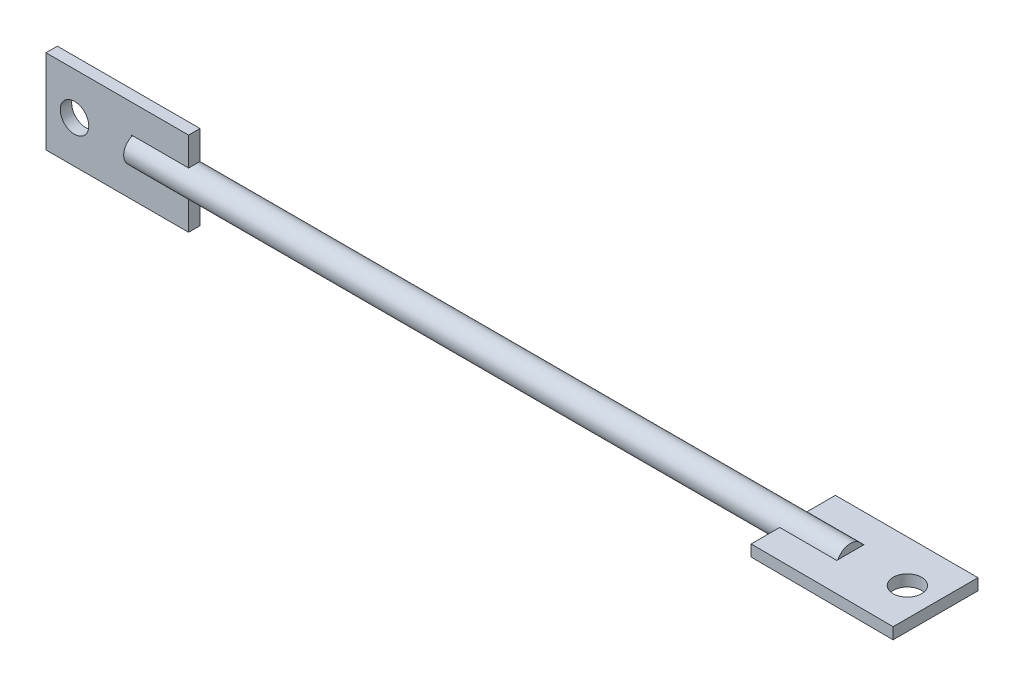
ISO-10303-21;
HEADER;
FILE_DESCRIPTION(('STEP AP214'),'2;1');
FILE_NAME('part.step','',(''),(''),'','','');
FILE_SCHEMA(('AUTOMOTIVE_DESIGN { 1 0 10303 214 1 1 1 1 }'));
ENDSEC;
DATA;
#1=APPLICATION_CONTEXT('core data for automotive mechanical design processes');
#2=APPLICATION_PROTOCOL_DEFINITION('international standard','automotive_design',2000,#1);
#3=PRODUCT_CONTEXT('',#1,'mechanical');
#4=PRODUCT('Part','Part','',(#3));
#5=PRODUCT_RELATED_PRODUCT_CATEGORY('part','',(#4));
#6=PRODUCT_DEFINITION_FORMATION('','',#4);
#7=PRODUCT_DEFINITION_CONTEXT('part definition',#1,'design');
#8=PRODUCT_DEFINITION('design','',#6,#7);
#9=PRODUCT_DEFINITION_SHAPE('','',#8);
#10=(LENGTH_UNIT() NAMED_UNIT(*) SI_UNIT(.MILLI.,.METRE.));
#11=(NAMED_UNIT(*) PLANE_ANGLE_UNIT() SI_UNIT($,.RADIAN.));
#12=(NAMED_UNIT(*) SI_UNIT($,.STERADIAN.) SOLID_ANGLE_UNIT());
#13=UNCERTAINTY_MEASURE_WITH_UNIT(LENGTH_MEASURE(1.E-05),#10,'distance_accuracy_value','');
#14=(GEOMETRIC_REPRESENTATION_CONTEXT(3) GLOBAL_UNCERTAINTY_ASSIGNED_CONTEXT((#13)) GLOBAL_UNIT_ASSIGNED_CONTEXT((#10,
#11,#12)) REPRESENTATION_CONTEXT('',''));
#15=CARTESIAN_POINT('',(0.,0.,0.));
#16=DIRECTION('',(0.,0.,1.));
#17=DIRECTION('',(1.,0.,0.));
#18=AXIS2_PLACEMENT_3D('',#15,#16,#17);
#19=CARTESIAN_POINT('',(0.,2.,-14.7625));
#20=DIRECTION('',(0.,0.,1.));
#21=DIRECTION('',(1.,0.,0.));
#22=AXIS2_PLACEMENT_3D('',#19,#20,#21);
#23=PLANE('',#22);
#24=DIRECTION('',(-1.,0.,0.));
#25=VECTOR('',#24,1.);
#26=CARTESIAN_POINT('',(0.,-2.,-14.7625));
#27=LINE('',#26,#25);
#28=CARTESIAN_POINT('',(155.,-2.,-14.7625000000001));
#29=VERTEX_POINT('',#28);
#30=CARTESIAN_POINT('',(105.,-2.,-14.7625));
#31=VERTEX_POINT('',#30);
#32=EDGE_CURVE('E151',#29,#31,#27,.T.);
#33=ORIENTED_EDGE('',*,*,#32,.T.);
#34=DIRECTION('',(0.,-1.,0.));
#35=VECTOR('',#34,1.);
#36=CARTESIAN_POINT('',(105.,2.,-14.7625));
#37=LINE('',#36,#35);
#38=CARTESIAN_POINT('',(105.,2.,-14.7625));
#39=VERTEX_POINT('',#38);
#40=EDGE_CURVE('E13',#39,#31,#37,.T.);
#41=ORIENTED_EDGE('',*,*,#40,.F.);
#42=DIRECTION('',(-1.,0.,0.));
#43=VECTOR('',#42,1.);
#44=CARTESIAN_POINT('',(0.,2.,-14.7625));
#45=LINE('',#44,#43);
#46=CARTESIAN_POINT('',(155.,2.,-14.7625000000001));
#47=VERTEX_POINT('',#46);
#48=EDGE_CURVE('E196',#47,#39,#45,.T.);
#49=ORIENTED_EDGE('',*,*,#48,.F.);
#50=DIRECTION('',(0.,-1.,0.));
#51=VECTOR('',#50,1.);
#52=CARTESIAN_POINT('',(155.,2.,-14.7625000000001));
#53=LINE('',#52,#51);
#54=EDGE_CURVE('E144',#47,#29,#53,.T.);
#55=ORIENTED_EDGE('',*,*,#54,.T.);
#56=EDGE_LOOP('',(#33,#41,#49,#55));
#57=FACE_BOUND('',#56,.T.);
#58=ADVANCED_FACE('F52',(#57),#23,.F.);
#59=CARTESIAN_POINT('',(105.,2.,-2.91433543964104E-13));
#60=DIRECTION('',(1.,0.,0.));
#61=DIRECTION('',(0.,0.,-1.));
#62=AXIS2_PLACEMENT_3D('',#59,#60,#61);
#63=PLANE('',#62);
#64=DIRECTION('',(0.,0.,1.));
#65=VECTOR('',#64,1.);
#66=CARTESIAN_POINT('',(105.,-2.,-2.91433543964104E-13));
#67=LINE('',#66,#65);
#68=CARTESIAN_POINT('',(105.,-2.,-4.76250000000004));
#69=VERTEX_POINT('',#68);
#70=EDGE_CURVE('E154',#31,#69,#67,.T.);
#71=ORIENTED_EDGE('',*,*,#70,.T.);
#72=DIRECTION('',(0.,-1.,0.));
#73=VECTOR('',#72,1.);
#74=CARTESIAN_POINT('',(105.,2.,-4.76250000000004));
#75=LINE('',#74,#73);
#76=CARTESIAN_POINT('',(105.,2.,-4.76250000000004));
#77=VERTEX_POINT('',#76);
#78=EDGE_CURVE('E61',#77,#69,#75,.T.);
#79=ORIENTED_EDGE('',*,*,#78,.F.);
#80=DIRECTION('',(0.,0.,1.));
#81=VECTOR('',#80,1.);
#82=CARTESIAN_POINT('',(105.,2.,-2.91433543964104E-13));
#83=LINE('',#82,#81);
#84=EDGE_CURVE('E112',#39,#77,#83,.T.);
#85=ORIENTED_EDGE('',*,*,#84,.F.);
#86=ORIENTED_EDGE('',*,*,#40,.T.);
#87=EDGE_LOOP('',(#71,#79,#85,#86));
#88=FACE_BOUND('',#87,.T.);
#89=ADVANCED_FACE('F182',(#88),#63,.F.);
#90=CARTESIAN_POINT('',(0.,2.,-4.76250000000002));
#91=DIRECTION('',(0.,0.,1.));
#92=DIRECTION('',(1.,0.,0.));
#93=AXIS2_PLACEMENT_3D('',#90,#91,#92);
#94=PLANE('',#93);
#95=DIRECTION('',(-1.,0.,0.));
#96=VECTOR('',#95,1.);
#97=CARTESIAN_POINT('',(0.,-2.,-4.76250000000002));
#98=LINE('',#97,#96);
#99=CARTESIAN_POINT('',(125.,-2.,-4.76250000000004));
#100=VERTEX_POINT('',#99);
#101=EDGE_CURVE('E157',#100,#69,#98,.T.);
#102=ORIENTED_EDGE('',*,*,#101,.F.);
#103=DIRECTION('',(0.,-1.,0.));
#104=VECTOR('',#103,1.);
#105=CARTESIAN_POINT('',(125.,2.,-4.76250000000004));
#106=LINE('',#105,#104);
#107=CARTESIAN_POINT('',(125.,2.,-4.76250000000004));
#108=VERTEX_POINT('',#107);
#109=EDGE_CURVE('E175',#108,#100,#106,.T.);
#110=ORIENTED_EDGE('',*,*,#109,.F.);
#111=DIRECTION('',(-1.,0.,0.));
#112=VECTOR('',#111,1.);
#113=CARTESIAN_POINT('',(0.,2.,-4.76250000000002));
#114=LINE('',#113,#112);
#115=EDGE_CURVE('E181',#108,#77,#114,.T.);
#116=ORIENTED_EDGE('',*,*,#115,.T.);
#117=ORIENTED_EDGE('',*,*,#78,.T.);
#118=EDGE_LOOP('',(#102,#110,#116,#117));
#119=FACE_BOUND('',#118,.T.);
#120=ADVANCED_FACE('F179',(#119),#94,.T.);
#121=CARTESIAN_POINT('',(125.,2.,0.));
#122=DIRECTION('',(1.,0.,0.));
#123=DIRECTION('',(0.,0.,-1.));
#124=AXIS2_PLACEMENT_3D('',#121,#122,#123);
#125=PLANE('',#124);
#126=DIRECTION('',(0.,0.,1.));
#127=VECTOR('',#126,1.);
#128=CARTESIAN_POINT('',(125.,-2.,0.));
#129=LINE('',#128,#127);
#130=CARTESIAN_POINT('',(125.,-2.,4.76249999999995));
#131=VERTEX_POINT('',#130);
#132=EDGE_CURVE('E160',#100,#131,#129,.T.);
#133=ORIENTED_EDGE('',*,*,#132,.T.);
#134=DIRECTION('',(0.,-1.,0.));
#135=VECTOR('',#134,1.);
#136=CARTESIAN_POINT('',(125.,2.,4.76249999999995));
#137=LINE('',#136,#135);
#138=CARTESIAN_POINT('',(125.,2.,4.76249999999995));
#139=VERTEX_POINT('',#138);
#140=EDGE_CURVE('E173',#139,#131,#137,.T.);
#141=ORIENTED_EDGE('',*,*,#140,.F.);
#142=DIRECTION('',(0.,0.,1.));
#143=VECTOR('',#142,1.);
#144=CARTESIAN_POINT('',(125.,2.,0.));
#145=LINE('',#144,#143);
#146=EDGE_CURVE('E193',#108,#139,#145,.T.);
#147=ORIENTED_EDGE('',*,*,#146,.F.);
#148=ORIENTED_EDGE('',*,*,#109,.T.);
#149=EDGE_LOOP('',(#133,#141,#147,#148));
#150=FACE_BOUND('',#149,.T.);
#151=ADVANCED_FACE('F191',(#150),#125,.F.);
#152=CARTESIAN_POINT('',(0.,2.,4.76249999999998));
#153=DIRECTION('',(0.,0.,-1.));
#154=DIRECTION('',(-1.,0.,0.));
#155=AXIS2_PLACEMENT_3D('',#152,#153,#154);
#156=PLANE('',#155);
#157=DIRECTION('',(1.,0.,0.));
#158=VECTOR('',#157,1.);
#159=CARTESIAN_POINT('',(0.,-2.,4.76249999999998));
#160=LINE('',#159,#158);
#161=CARTESIAN_POINT('',(105.,-2.,4.76249999999996));
#162=VERTEX_POINT('',#161);
#163=EDGE_CURVE('E163',#162,#131,#160,.T.);
#164=ORIENTED_EDGE('',*,*,#163,.F.);
#165=DIRECTION('',(0.,-1.,0.));
#166=VECTOR('',#165,1.);
#167=CARTESIAN_POINT('',(105.,2.,4.76249999999996));
#168=LINE('',#167,#166);
#169=CARTESIAN_POINT('',(105.,2.,4.76249999999996));
#170=VERTEX_POINT('',#169);
#171=EDGE_CURVE('E139',#170,#162,#168,.T.);
#172=ORIENTED_EDGE('',*,*,#171,.F.);
#173=DIRECTION('',(1.,0.,0.));
#174=VECTOR('',#173,1.);
#175=CARTESIAN_POINT('',(0.,2.,4.76249999999998));
#176=LINE('',#175,#174);
#177=EDGE_CURVE('E132',#170,#139,#176,.T.);
#178=ORIENTED_EDGE('',*,*,#177,.T.);
#179=ORIENTED_EDGE('',*,*,#140,.T.);
#180=EDGE_LOOP('',(#164,#172,#178,#179));
#181=FACE_BOUND('',#180,.T.);
#182=ADVANCED_FACE('F200',(#181),#156,.T.);
#183=CARTESIAN_POINT('',(105.,2.,0.));
#184=DIRECTION('',(1.,0.,0.));
#185=DIRECTION('',(0.,0.,-1.));
#186=AXIS2_PLACEMENT_3D('',#183,#184,#185);
#187=PLANE('',#186);
#188=DIRECTION('',(0.,0.,1.));
#189=VECTOR('',#188,1.);
#190=CARTESIAN_POINT('',(105.,-2.,0.));
#191=LINE('',#190,#189);
#192=CARTESIAN_POINT('',(105.,-2.,14.7625));
#193=VERTEX_POINT('',#192);
#194=EDGE_CURVE('E138',#162,#193,#191,.T.);
#195=ORIENTED_EDGE('',*,*,#194,.T.);
#196=DIRECTION('',(0.,-1.,0.));
#197=VECTOR('',#196,1.);
#198=CARTESIAN_POINT('',(105.,2.,14.7625));
#199=LINE('',#198,#197);
#200=CARTESIAN_POINT('',(105.,2.,14.7625));
#201=VERTEX_POINT('',#200);
#202=EDGE_CURVE('E135',#201,#193,#199,.T.);
#203=ORIENTED_EDGE('',*,*,#202,.F.);
#204=DIRECTION('',(0.,0.,1.));
#205=VECTOR('',#204,1.);
#206=CARTESIAN_POINT('',(105.,2.,0.));
#207=LINE('',#206,#205);
#208=EDGE_CURVE('E126',#170,#201,#207,.T.);
#209=ORIENTED_EDGE('',*,*,#208,.F.);
#210=ORIENTED_EDGE('',*,*,#171,.T.);
#211=EDGE_LOOP('',(#195,#203,#209,#210));
#212=FACE_BOUND('',#211,.T.);
#213=ADVANCED_FACE('F136',(#212),#187,.F.);
#214=CARTESIAN_POINT('',(-0.0674266261516821,2.,14.2659075417125));
#215=DIRECTION('',(0.00472636408478711,0.,-0.999988830678892));
#216=DIRECTION('',(-0.999988830678892,0.,-0.00472636408478711));
#217=AXIS2_PLACEMENT_3D('',#214,#215,#216);
#218=PLANE('',#217);
#219=DIRECTION('',(0.999988830678892,0.,0.00472636408478711));
#220=VECTOR('',#219,1.);
#221=CARTESIAN_POINT('',(-0.0674266261516821,-2.,14.2659075417125));
#222=LINE('',#221,#220);
#223=CARTESIAN_POINT('',(154.999441533945,-2.,14.9988182042393));
#224=VERTEX_POINT('',#223);
#225=EDGE_CURVE('E98',#193,#224,#222,.T.);
#226=ORIENTED_EDGE('',*,*,#225,.T.);
#227=DIRECTION('',(0.,-1.,0.));
#228=VECTOR('',#227,1.);
#229=CARTESIAN_POINT('',(154.999441533945,2.,14.9988182042393));
#230=LINE('',#229,#228);
#231=CARTESIAN_POINT('',(154.999441533945,2.,14.9988182042393));
#232=VERTEX_POINT('',#231);
#233=EDGE_CURVE('E140',#232,#224,#230,.T.);
#234=ORIENTED_EDGE('',*,*,#233,.F.);
#235=DIRECTION('',(0.999988830678892,0.,0.00472636408478711));
#236=VECTOR('',#235,1.);
#237=CARTESIAN_POINT('',(-0.0674266261516821,2.,14.2659075417125));
#238=LINE('',#237,#236);
#239=EDGE_CURVE('E130',#201,#232,#238,.T.);
#240=ORIENTED_EDGE('',*,*,#239,.F.);
#241=ORIENTED_EDGE('',*,*,#202,.T.);
#242=EDGE_LOOP('',(#226,#234,#240,#241));
#243=FACE_BOUND('',#242,.T.);
#244=ADVANCED_FACE('F142',(#243),#218,.F.);
#245=CARTESIAN_POINT('',(144.999722982447,2.,0.));
#246=DIRECTION('',(0.,-1.,0.));
#247=DIRECTION('',(0.,0.,-1.));
#248=AXIS2_PLACEMENT_3D('',#245,#246,#247);
#249=CYLINDRICAL_SURFACE('',#248,4.99999999999996);
#250=CARTESIAN_POINT('',(144.999722982447,2.,0.));
#251=DIRECTION('',(0.,1.,0.));
#252=DIRECTION('',(0.,0.,1.));
#253=AXIS2_PLACEMENT_3D('',#250,#251,#252);
#254=CIRCLE('',#253,4.99999999999996);
#255=CARTESIAN_POINT('',(144.999722982447,2.,4.99999999999996));
#256=VERTEX_POINT('',#255);
#257=EDGE_CURVE('E169',#256,#256,#254,.T.);
#258=ORIENTED_EDGE('',*,*,#257,.T.);
#259=EDGE_LOOP('',(#258));
#260=FACE_BOUND('',#259,.T.);
#261=CARTESIAN_POINT('',(144.999722982447,-2.,0.));
#262=DIRECTION('',(0.,1.,0.));
#263=DIRECTION('',(0.,0.,1.));
#264=AXIS2_PLACEMENT_3D('',#261,#262,#263);
#265=CIRCLE('',#264,4.99999999999996);
#266=CARTESIAN_POINT('',(144.999722982447,-2.,4.99999999999996));
#267=VERTEX_POINT('',#266);
#268=EDGE_CURVE('E148',#267,#267,#265,.T.);
#269=ORIENTED_EDGE('',*,*,#268,.F.);
#270=EDGE_LOOP('',(#269));
#271=FACE_BOUND('',#270,.T.);
#272=ADVANCED_FACE('F54',(#260,#271),#249,.F.);
#273=CARTESIAN_POINT('',(154.999722929629,2.,0.00290854333956947));
#274=DIRECTION('',(-0.99999999982394,0.,-1.87648292789393E-05));
#275=DIRECTION('',(-1.87648292789393E-05,0.,0.999999999823941));
#276=AXIS2_PLACEMENT_3D('',#273,#274,#275);
#277=PLANE('',#276);
#278=DIRECTION('',(1.87648292789393E-05,0.,-0.999999999823941));
#279=VECTOR('',#278,1.);
#280=CARTESIAN_POINT('',(154.999722929629,-2.,0.00290854333956947));
#281=LINE('',#280,#279);
#282=EDGE_CURVE('E104',#224,#29,#281,.T.);
#283=ORIENTED_EDGE('',*,*,#282,.T.);
#284=ORIENTED_EDGE('',*,*,#54,.F.);
#285=DIRECTION('',(1.87648292789393E-05,0.,-0.999999999823941));
#286=VECTOR('',#285,1.);
#287=CARTESIAN_POINT('',(154.999722929629,2.,0.00290854333956947));
#288=LINE('',#287,#286);
#289=EDGE_CURVE('E69',#232,#47,#288,.T.);
#290=ORIENTED_EDGE('',*,*,#289,.F.);
#291=ORIENTED_EDGE('',*,*,#233,.T.);
#292=EDGE_LOOP('',(#283,#284,#290,#291));
#293=FACE_BOUND('',#292,.T.);
#294=ADVANCED_FACE('F203',(#293),#277,.F.);
#295=CARTESIAN_POINT('',(0.,2.,0.));
#296=DIRECTION('',(0.,1.,0.));
#297=DIRECTION('',(0.,0.,1.));
#298=AXIS2_PLACEMENT_3D('',#295,#296,#297);
#299=PLANE('',#298);
#300=ORIENTED_EDGE('',*,*,#257,.F.);
#301=EDGE_LOOP('',(#300));
#302=FACE_BOUND('',#301,.T.);
#303=ORIENTED_EDGE('',*,*,#48,.T.);
#304=ORIENTED_EDGE('',*,*,#84,.T.);
#305=ORIENTED_EDGE('',*,*,#115,.F.);
#306=ORIENTED_EDGE('',*,*,#146,.T.);
#307=ORIENTED_EDGE('',*,*,#177,.F.);
#308=ORIENTED_EDGE('',*,*,#208,.T.);
#309=ORIENTED_EDGE('',*,*,#239,.T.);
#310=ORIENTED_EDGE('',*,*,#289,.T.);
#311=EDGE_LOOP('',(#303,#304,#305,#306,#307,#308,#309,#310));
#312=FACE_BOUND('',#311,.T.);
#313=ADVANCED_FACE('F128',(#302,#312),#299,.T.);
#314=CARTESIAN_POINT('',(0.,-2.,0.));
#315=DIRECTION('',(0.,1.,0.));
#316=DIRECTION('',(0.,0.,1.));
#317=AXIS2_PLACEMENT_3D('',#314,#315,#316);
#318=PLANE('',#317);
#319=ORIENTED_EDGE('',*,*,#268,.T.);
#320=EDGE_LOOP('',(#319));
#321=FACE_BOUND('',#320,.T.);
#322=ORIENTED_EDGE('',*,*,#32,.F.);
#323=ORIENTED_EDGE('',*,*,#282,.F.);
#324=ORIENTED_EDGE('',*,*,#225,.F.);
#325=ORIENTED_EDGE('',*,*,#194,.F.);
#326=ORIENTED_EDGE('',*,*,#163,.T.);
#327=ORIENTED_EDGE('',*,*,#132,.F.);
#328=ORIENTED_EDGE('',*,*,#101,.T.);
#329=ORIENTED_EDGE('',*,*,#70,.F.);
#330=EDGE_LOOP('',(#322,#323,#324,#325,#326,#327,#328,#329));
#331=FACE_BOUND('',#330,.T.);
#332=ADVANCED_FACE('F187',(#321,#331),#318,.F.);
#333=CLOSED_SHELL('',(#58,#89,#120,#151,#182,#213,#244,#272,#294,#313,#332));
#334=MANIFOLD_SOLID_BREP('B2',#333);
#335=CARTESIAN_POINT('',(0.,-14.7625,2.));
#336=DIRECTION('',(0.,1.,0.));
#337=DIRECTION('',(-1.,0.,0.));
#338=AXIS2_PLACEMENT_3D('',#335,#336,#337);
#339=PLANE('',#338);
#340=DIRECTION('',(1.,0.,0.));
#341=VECTOR('',#340,1.);
#342=CARTESIAN_POINT('',(0.,-14.7625,-2.));
#343=LINE('',#342,#341);
#344=CARTESIAN_POINT('',(-155.,-14.7625,-2.));
#345=VERTEX_POINT('',#344);
#346=CARTESIAN_POINT('',(-105.,-14.7625,-2.));
#347=VERTEX_POINT('',#346);
#348=EDGE_CURVE('E410',#345,#347,#343,.T.);
#349=ORIENTED_EDGE('',*,*,#348,.T.);
#350=DIRECTION('',(0.,0.,-1.));
#351=VECTOR('',#350,1.);
#352=CARTESIAN_POINT('',(-105.,-14.7625,2.));
#353=LINE('',#352,#351);
#354=CARTESIAN_POINT('',(-105.,-14.7625,2.));
#355=VERTEX_POINT('',#354);
#356=EDGE_CURVE('E50',#355,#347,#353,.T.);
#357=ORIENTED_EDGE('',*,*,#356,.F.);
#358=DIRECTION('',(1.,0.,0.));
#359=VECTOR('',#358,1.);
#360=CARTESIAN_POINT('',(0.,-14.7625,2.));
#361=LINE('',#360,#359);
#362=CARTESIAN_POINT('',(-155.,-14.7625,2.));
#363=VERTEX_POINT('',#362);
#364=EDGE_CURVE('E454',#363,#355,#361,.T.);
#365=ORIENTED_EDGE('',*,*,#364,.F.);
#366=DIRECTION('',(0.,0.,-1.));
#367=VECTOR('',#366,1.);
#368=CARTESIAN_POINT('',(-155.,-14.7625,2.));
#369=LINE('',#368,#367);
#370=EDGE_CURVE('E403',#363,#345,#369,.T.);
#371=ORIENTED_EDGE('',*,*,#370,.T.);
#372=EDGE_LOOP('',(#349,#357,#365,#371));
#373=FACE_BOUND('',#372,.T.);
#374=ADVANCED_FACE('F310',(#373),#339,.F.);
#375=CARTESIAN_POINT('',(-105.,4.37150315946155E-13,2.));
#376=DIRECTION('',(-1.,0.,0.));
#377=DIRECTION('',(0.,-1.,0.));
#378=AXIS2_PLACEMENT_3D('',#375,#376,#377);
#379=PLANE('',#378);
#380=DIRECTION('',(0.,1.,0.));
#381=VECTOR('',#380,1.);
#382=CARTESIAN_POINT('',(-105.,4.37150315946155E-13,-2.));
#383=LINE('',#382,#381);
#384=CARTESIAN_POINT('',(-105.,-4.7625,-2.));
#385=VERTEX_POINT('',#384);
#386=EDGE_CURVE('E413',#347,#385,#383,.T.);
#387=ORIENTED_EDGE('',*,*,#386,.T.);
#388=DIRECTION('',(0.,0.,-1.));
#389=VECTOR('',#388,1.);
#390=CARTESIAN_POINT('',(-105.,-4.7625,2.));
#391=LINE('',#390,#389);
#392=CARTESIAN_POINT('',(-105.,-4.7625,2.));
#393=VERTEX_POINT('',#392);
#394=EDGE_CURVE('E319',#393,#385,#391,.T.);
#395=ORIENTED_EDGE('',*,*,#394,.F.);
#396=DIRECTION('',(0.,1.,0.));
#397=VECTOR('',#396,1.);
#398=CARTESIAN_POINT('',(-105.,4.37150315946155E-13,2.));
#399=LINE('',#398,#397);
#400=EDGE_CURVE('E370',#355,#393,#399,.T.);
#401=ORIENTED_EDGE('',*,*,#400,.F.);
#402=ORIENTED_EDGE('',*,*,#356,.T.);
#403=EDGE_LOOP('',(#387,#395,#401,#402));
#404=FACE_BOUND('',#403,.T.);
#405=ADVANCED_FACE('F441',(#404),#379,.F.);
#406=CARTESIAN_POINT('',(0.,-4.7625,2.));
#407=DIRECTION('',(0.,1.,0.));
#408=DIRECTION('',(0.,0.,1.));
#409=AXIS2_PLACEMENT_3D('',#406,#407,#408);
#410=PLANE('',#409);
#411=DIRECTION('',(1.,0.,0.));
#412=VECTOR('',#411,1.);
#413=CARTESIAN_POINT('',(0.,-4.7625,-2.));
#414=LINE('',#413,#412);
#415=CARTESIAN_POINT('',(-125.,-4.7625,-2.));
#416=VERTEX_POINT('',#415);
#417=EDGE_CURVE('E416',#416,#385,#414,.T.);
#418=ORIENTED_EDGE('',*,*,#417,.F.);
#419=DIRECTION('',(0.,0.,-1.));
#420=VECTOR('',#419,1.);
#421=CARTESIAN_POINT('',(-125.,-4.7625,2.));
#422=LINE('',#421,#420);
#423=CARTESIAN_POINT('',(-125.,-4.7625,2.));
#424=VERTEX_POINT('',#423);
#425=EDGE_CURVE('E434',#424,#416,#422,.T.);
#426=ORIENTED_EDGE('',*,*,#425,.F.);
#427=DIRECTION('',(1.,0.,0.));
#428=VECTOR('',#427,1.);
#429=CARTESIAN_POINT('',(0.,-4.7625,2.));
#430=LINE('',#429,#428);
#431=EDGE_CURVE('E440',#424,#393,#430,.T.);
#432=ORIENTED_EDGE('',*,*,#431,.T.);
#433=ORIENTED_EDGE('',*,*,#394,.T.);
#434=EDGE_LOOP('',(#418,#426,#432,#433));
#435=FACE_BOUND('',#434,.T.);
#436=ADVANCED_FACE('F438',(#435),#410,.T.);
#437=CARTESIAN_POINT('',(-125.,0.,2.));
#438=DIRECTION('',(1.,0.,0.));
#439=DIRECTION('',(0.,0.,-1.));
#440=AXIS2_PLACEMENT_3D('',#437,#438,#439);
#441=PLANE('',#440);
#442=DIRECTION('',(0.,-1.,0.));
#443=VECTOR('',#442,1.);
#444=CARTESIAN_POINT('',(-125.,0.,-2.));
#445=LINE('',#444,#443);
#446=CARTESIAN_POINT('',(-125.,4.7625,-2.));
#447=VERTEX_POINT('',#446);
#448=EDGE_CURVE('E419',#447,#416,#445,.T.);
#449=ORIENTED_EDGE('',*,*,#448,.F.);
#450=DIRECTION('',(0.,0.,-1.));
#451=VECTOR('',#450,1.);
#452=CARTESIAN_POINT('',(-125.,4.7625,2.));
#453=LINE('',#452,#451);
#454=CARTESIAN_POINT('',(-125.,4.7625,2.));
#455=VERTEX_POINT('',#454);
#456=EDGE_CURVE('E432',#455,#447,#453,.T.);
#457=ORIENTED_EDGE('',*,*,#456,.F.);
#458=DIRECTION('',(0.,-1.,0.));
#459=VECTOR('',#458,1.);
#460=CARTESIAN_POINT('',(-125.,0.,2.));
#461=LINE('',#460,#459);
#462=EDGE_CURVE('E451',#455,#424,#461,.T.);
#463=ORIENTED_EDGE('',*,*,#462,.T.);
#464=ORIENTED_EDGE('',*,*,#425,.T.);
#465=EDGE_LOOP('',(#449,#457,#463,#464));
#466=FACE_BOUND('',#465,.T.);
#467=ADVANCED_FACE('F449',(#466),#441,.T.);
#468=CARTESIAN_POINT('',(0.,4.7625,2.));
#469=DIRECTION('',(0.,-1.,0.));
#470=DIRECTION('',(0.,0.,-1.));
#471=AXIS2_PLACEMENT_3D('',#468,#469,#470);
#472=PLANE('',#471);
#473=DIRECTION('',(-1.,0.,0.));
#474=VECTOR('',#473,1.);
#475=CARTESIAN_POINT('',(0.,4.7625,-2.));
#476=LINE('',#475,#474);
#477=CARTESIAN_POINT('',(-105.,4.7625,-2.));
#478=VERTEX_POINT('',#477);
#479=EDGE_CURVE('E422',#478,#447,#476,.T.);
#480=ORIENTED_EDGE('',*,*,#479,.F.);
#481=DIRECTION('',(0.,0.,-1.));
#482=VECTOR('',#481,1.);
#483=CARTESIAN_POINT('',(-105.,4.7625,2.));
#484=LINE('',#483,#482);
#485=CARTESIAN_POINT('',(-105.,4.7625,2.));
#486=VERTEX_POINT('',#485);
#487=EDGE_CURVE('E398',#486,#478,#484,.T.);
#488=ORIENTED_EDGE('',*,*,#487,.F.);
#489=DIRECTION('',(-1.,0.,0.));
#490=VECTOR('',#489,1.);
#491=CARTESIAN_POINT('',(0.,4.7625,2.));
#492=LINE('',#491,#490);
#493=EDGE_CURVE('E391',#486,#455,#492,.T.);
#494=ORIENTED_EDGE('',*,*,#493,.T.);
#495=ORIENTED_EDGE('',*,*,#456,.T.);
#496=EDGE_LOOP('',(#480,#488,#494,#495));
#497=FACE_BOUND('',#496,.T.);
#498=ADVANCED_FACE('F458',(#497),#472,.T.);
#499=CARTESIAN_POINT('',(-105.,-4.37150315946155E-13,2.));
#500=DIRECTION('',(-1.,0.,0.));
#501=DIRECTION('',(0.,-1.,0.));
#502=AXIS2_PLACEMENT_3D('',#499,#500,#501);
#503=PLANE('',#502);
#504=DIRECTION('',(0.,1.,0.));
#505=VECTOR('',#504,1.);
#506=CARTESIAN_POINT('',(-105.,-4.37150315946155E-13,-2.));
#507=LINE('',#506,#505);
#508=CARTESIAN_POINT('',(-105.,14.7625,-2.));
#509=VERTEX_POINT('',#508);
#510=EDGE_CURVE('E397',#478,#509,#507,.T.);
#511=ORIENTED_EDGE('',*,*,#510,.T.);
#512=DIRECTION('',(0.,0.,-1.));
#513=VECTOR('',#512,1.);
#514=CARTESIAN_POINT('',(-105.,14.7625,2.));
#515=LINE('',#514,#513);
#516=CARTESIAN_POINT('',(-105.,14.7625,2.));
#517=VERTEX_POINT('',#516);
#518=EDGE_CURVE('E394',#517,#509,#515,.T.);
#519=ORIENTED_EDGE('',*,*,#518,.F.);
#520=DIRECTION('',(0.,1.,0.));
#521=VECTOR('',#520,1.);
#522=CARTESIAN_POINT('',(-105.,-4.37150315946155E-13,2.));
#523=LINE('',#522,#521);
#524=EDGE_CURVE('E384',#486,#517,#523,.T.);
#525=ORIENTED_EDGE('',*,*,#524,.F.);
#526=ORIENTED_EDGE('',*,*,#487,.T.);
#527=EDGE_LOOP('',(#511,#519,#525,#526));
#528=FACE_BOUND('',#527,.T.);
#529=ADVANCED_FACE('F395',(#528),#503,.F.);
#530=CARTESIAN_POINT('',(0.,14.7625,2.));
#531=DIRECTION('',(0.,-1.,0.));
#532=DIRECTION('',(1.,0.,0.));
#533=AXIS2_PLACEMENT_3D('',#530,#531,#532);
#534=PLANE('',#533);
#535=DIRECTION('',(-1.,0.,0.));
#536=VECTOR('',#535,1.);
#537=CARTESIAN_POINT('',(0.,14.7625,-2.));
#538=LINE('',#537,#536);
#539=CARTESIAN_POINT('',(-155.,14.7625,-2.));
#540=VERTEX_POINT('',#539);
#541=EDGE_CURVE('E356',#509,#540,#538,.T.);
#542=ORIENTED_EDGE('',*,*,#541,.T.);
#543=DIRECTION('',(0.,0.,-1.));
#544=VECTOR('',#543,1.);
#545=CARTESIAN_POINT('',(-155.,14.7625,2.));
#546=LINE('',#545,#544);
#547=CARTESIAN_POINT('',(-155.,14.7625,2.));
#548=VERTEX_POINT('',#547);
#549=EDGE_CURVE('E399',#548,#540,#546,.T.);
#550=ORIENTED_EDGE('',*,*,#549,.F.);
#551=DIRECTION('',(-1.,0.,0.));
#552=VECTOR('',#551,1.);
#553=CARTESIAN_POINT('',(0.,14.7625,2.));
#554=LINE('',#553,#552);
#555=EDGE_CURVE('E388',#517,#548,#554,.T.);
#556=ORIENTED_EDGE('',*,*,#555,.F.);
#557=ORIENTED_EDGE('',*,*,#518,.T.);
#558=EDGE_LOOP('',(#542,#550,#556,#557));
#559=FACE_BOUND('',#558,.T.);
#560=ADVANCED_FACE('F401',(#559),#534,.F.);
#561=CARTESIAN_POINT('',(-145.,0.,2.));
#562=DIRECTION('',(0.,0.,-1.));
#563=DIRECTION('',(-1.,0.,0.));
#564=AXIS2_PLACEMENT_3D('',#561,#562,#563);
#565=CYLINDRICAL_SURFACE('',#564,4.99999999999999);
#566=CARTESIAN_POINT('',(-145.,0.,2.));
#567=DIRECTION('',(0.,0.,1.));
#568=DIRECTION('',(1.,0.,0.));
#569=AXIS2_PLACEMENT_3D('',#566,#567,#568);
#570=CIRCLE('',#569,4.99999999999999);
#571=CARTESIAN_POINT('',(-140.,0.,2.));
#572=VERTEX_POINT('',#571);
#573=EDGE_CURVE('E428',#572,#572,#570,.T.);
#574=ORIENTED_EDGE('',*,*,#573,.T.);
#575=EDGE_LOOP('',(#574));
#576=FACE_BOUND('',#575,.T.);
#577=CARTESIAN_POINT('',(-145.,0.,-2.));
#578=DIRECTION('',(0.,0.,1.));
#579=DIRECTION('',(1.,0.,0.));
#580=AXIS2_PLACEMENT_3D('',#577,#578,#579);
#581=CIRCLE('',#580,4.99999999999999);
#582=CARTESIAN_POINT('',(-140.,0.,-2.));
#583=VERTEX_POINT('',#582);
#584=EDGE_CURVE('E407',#583,#583,#581,.T.);
#585=ORIENTED_EDGE('',*,*,#584,.F.);
#586=EDGE_LOOP('',(#585));
#587=FACE_BOUND('',#586,.T.);
#588=ADVANCED_FACE('F312',(#576,#587),#565,.F.);
#589=CARTESIAN_POINT('',(-155.,0.,2.));
#590=DIRECTION('',(1.,0.,0.));
#591=DIRECTION('',(0.,0.,-1.));
#592=AXIS2_PLACEMENT_3D('',#589,#590,#591);
#593=PLANE('',#592);
#594=DIRECTION('',(0.,-1.,0.));
#595=VECTOR('',#594,1.);
#596=CARTESIAN_POINT('',(-155.,0.,-2.));
#597=LINE('',#596,#595);
#598=EDGE_CURVE('E362',#540,#345,#597,.T.);
#599=ORIENTED_EDGE('',*,*,#598,.T.);
#600=ORIENTED_EDGE('',*,*,#370,.F.);
#601=DIRECTION('',(0.,-1.,0.));
#602=VECTOR('',#601,1.);
#603=CARTESIAN_POINT('',(-155.,0.,2.));
#604=LINE('',#603,#602);
#605=EDGE_CURVE('E327',#548,#363,#604,.T.);
#606=ORIENTED_EDGE('',*,*,#605,.F.);
#607=ORIENTED_EDGE('',*,*,#549,.T.);
#608=EDGE_LOOP('',(#599,#600,#606,#607));
#609=FACE_BOUND('',#608,.T.);
#610=ADVANCED_FACE('F461',(#609),#593,.F.);
#611=CARTESIAN_POINT('',(0.,0.,2.));
#612=DIRECTION('',(0.,0.,1.));
#613=DIRECTION('',(1.,0.,0.));
#614=AXIS2_PLACEMENT_3D('',#611,#612,#613);
#615=PLANE('',#614);
#616=ORIENTED_EDGE('',*,*,#573,.F.);
#617=EDGE_LOOP('',(#616));
#618=FACE_BOUND('',#617,.T.);
#619=ORIENTED_EDGE('',*,*,#364,.T.);
#620=ORIENTED_EDGE('',*,*,#400,.T.);
#621=ORIENTED_EDGE('',*,*,#431,.F.);
#622=ORIENTED_EDGE('',*,*,#462,.F.);
#623=ORIENTED_EDGE('',*,*,#493,.F.);
#624=ORIENTED_EDGE('',*,*,#524,.T.);
#625=ORIENTED_EDGE('',*,*,#555,.T.);
#626=ORIENTED_EDGE('',*,*,#605,.T.);
#627=EDGE_LOOP('',(#619,#620,#621,#622,#623,#624,#625,#626));
#628=FACE_BOUND('',#627,.T.);
#629=ADVANCED_FACE('F386',(#618,#628),#615,.T.);
#630=CARTESIAN_POINT('',(0.,0.,-2.));
#631=DIRECTION('',(0.,0.,1.));
#632=DIRECTION('',(1.,0.,0.));
#633=AXIS2_PLACEMENT_3D('',#630,#631,#632);
#634=PLANE('',#633);
#635=ORIENTED_EDGE('',*,*,#584,.T.);
#636=EDGE_LOOP('',(#635));
#637=FACE_BOUND('',#636,.T.);
#638=ORIENTED_EDGE('',*,*,#348,.F.);
#639=ORIENTED_EDGE('',*,*,#598,.F.);
#640=ORIENTED_EDGE('',*,*,#541,.F.);
#641=ORIENTED_EDGE('',*,*,#510,.F.);
#642=ORIENTED_EDGE('',*,*,#479,.T.);
#643=ORIENTED_EDGE('',*,*,#448,.T.);
#644=ORIENTED_EDGE('',*,*,#417,.T.);
#645=ORIENTED_EDGE('',*,*,#386,.F.);
#646=EDGE_LOOP('',(#638,#639,#640,#641,#642,#643,#644,#645));
#647=FACE_BOUND('',#646,.T.);
#648=ADVANCED_FACE('F445',(#637,#647),#634,.F.);
#649=CLOSED_SHELL('',(#374,#405,#436,#467,#498,#529,#560,#588,#610,#629,#648));
#650=MANIFOLD_SOLID_BREP('B7',#649);
#651=CARTESIAN_POINT('',(-125.,0.,0.));
#652=DIRECTION('',(1.,0.,0.));
#653=DIRECTION('',(0.,0.,-1.));
#654=AXIS2_PLACEMENT_3D('',#651,#652,#653);
#655=PLANE('',#654);
#656=CARTESIAN_POINT('',(-125.,0.,0.));
#657=DIRECTION('',(1.,0.,0.));
#658=DIRECTION('',(0.,0.,-1.));
#659=AXIS2_PLACEMENT_3D('',#656,#657,#658);
#660=CIRCLE('',#659,4.7625);
#661=CARTESIAN_POINT('',(-125.,0.,-4.7625));
#662=VERTEX_POINT('',#661);
#663=EDGE_CURVE('E566',#662,#662,#660,.T.);
#664=ORIENTED_EDGE('',*,*,#663,.F.);
#665=EDGE_LOOP('',(#664));
#666=FACE_BOUND('',#665,.T.);
#667=ADVANCED_FACE('F559',(#666),#655,.F.);
#668=CARTESIAN_POINT('',(125.,0.,0.));
#669=DIRECTION('',(1.,0.,0.));
#670=DIRECTION('',(0.,0.,-1.));
#671=AXIS2_PLACEMENT_3D('',#668,#669,#670);
#672=PLANE('',#671);
#673=CARTESIAN_POINT('',(125.,0.,0.));
#674=DIRECTION('',(1.,0.,0.));
#675=DIRECTION('',(0.,0.,-1.));
#676=AXIS2_PLACEMENT_3D('',#673,#674,#675);
#677=CIRCLE('',#676,4.7625);
#678=CARTESIAN_POINT('',(125.,0.,-4.76250000000005));
#679=VERTEX_POINT('',#678);
#680=EDGE_CURVE('E308',#679,#679,#677,.T.);
#681=ORIENTED_EDGE('',*,*,#680,.T.);
#682=EDGE_LOOP('',(#681));
#683=FACE_BOUND('',#682,.T.);
#684=ADVANCED_FACE('F573',(#683),#672,.T.);
#685=CARTESIAN_POINT('',(-125.,0.,0.));
#686=DIRECTION('',(1.,0.,0.));
#687=DIRECTION('',(0.,0.,-1.));
#688=AXIS2_PLACEMENT_3D('',#685,#686,#687);
#689=CYLINDRICAL_SURFACE('',#688,4.7625);
#690=ORIENTED_EDGE('',*,*,#680,.F.);
#691=EDGE_LOOP('',(#690));
#692=FACE_BOUND('',#691,.T.);
#693=ORIENTED_EDGE('',*,*,#663,.T.);
#694=EDGE_LOOP('',(#693));
#695=FACE_BOUND('',#694,.T.);
#696=ADVANCED_FACE('F575',(#692,#695),#689,.T.);
#697=CLOSED_SHELL('',(#667,#684,#696));
#698=MANIFOLD_SOLID_BREP('B44',#697);
#699=ADVANCED_BREP_SHAPE_REPRESENTATION('',(#18,#334,#650,#698),#14);
#700=SHAPE_DEFINITION_REPRESENTATION(#9,#699);
ENDSEC;
END-ISO-10303-21;
